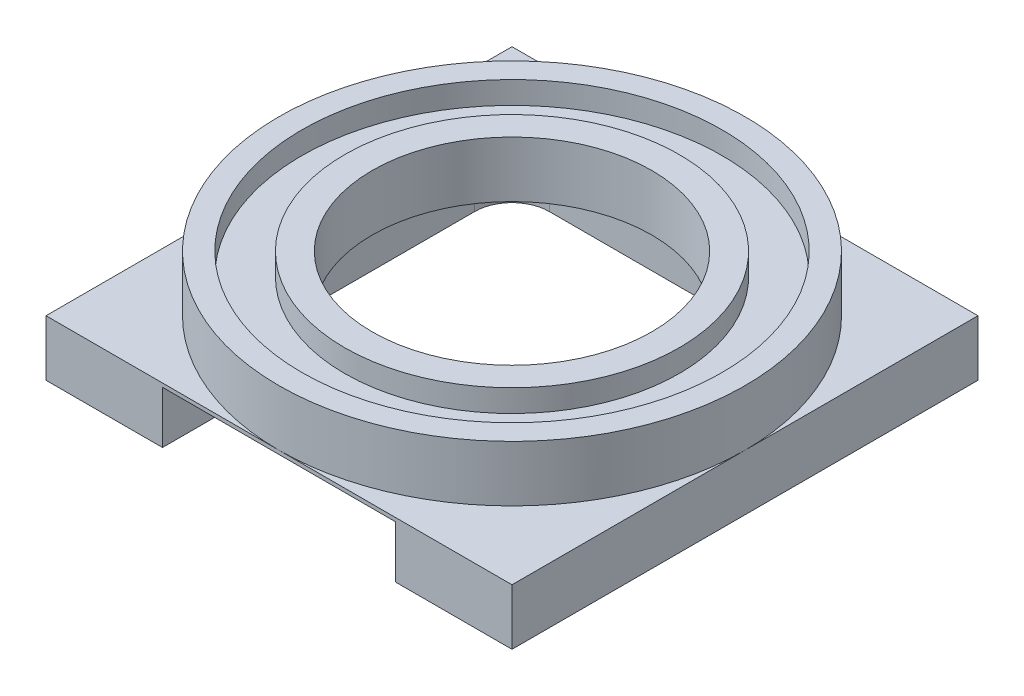
ISO-10303-21;
HEADER;
FILE_DESCRIPTION(('STEP AP214'),'2;1');
FILE_NAME('part.step','',(''),(''),'','','');
FILE_SCHEMA(('AUTOMOTIVE_DESIGN { 1 0 10303 214 1 1 1 1 }'));
ENDSEC;
DATA;
#1=APPLICATION_CONTEXT('core data for automotive mechanical design processes');
#2=APPLICATION_PROTOCOL_DEFINITION('international standard','automotive_design',2000,#1);
#3=PRODUCT_CONTEXT('',#1,'mechanical');
#4=PRODUCT('Part','Part','',(#3));
#5=PRODUCT_RELATED_PRODUCT_CATEGORY('part','',(#4));
#6=PRODUCT_DEFINITION_FORMATION('','',#4);
#7=PRODUCT_DEFINITION_CONTEXT('part definition',#1,'design');
#8=PRODUCT_DEFINITION('design','',#6,#7);
#9=PRODUCT_DEFINITION_SHAPE('','',#8);
#10=(LENGTH_UNIT() NAMED_UNIT(*) SI_UNIT(.MILLI.,.METRE.));
#11=(NAMED_UNIT(*) PLANE_ANGLE_UNIT() SI_UNIT($,.RADIAN.));
#12=(NAMED_UNIT(*) SI_UNIT($,.STERADIAN.) SOLID_ANGLE_UNIT());
#13=UNCERTAINTY_MEASURE_WITH_UNIT(LENGTH_MEASURE(1.E-05),#10,'distance_accuracy_value','');
#14=(GEOMETRIC_REPRESENTATION_CONTEXT(3) GLOBAL_UNCERTAINTY_ASSIGNED_CONTEXT((#13)) GLOBAL_UNIT_ASSIGNED_CONTEXT((#10,
#11,#12)) REPRESENTATION_CONTEXT('',''));
#15=CARTESIAN_POINT('',(0.,0.,0.));
#16=DIRECTION('',(0.,0.,1.));
#17=DIRECTION('',(1.,0.,0.));
#18=AXIS2_PLACEMENT_3D('',#15,#16,#17);
#19=CARTESIAN_POINT('',(0.,0.,0.));
#20=DIRECTION('',(0.,1.,0.));
#21=DIRECTION('',(0.,0.,1.));
#22=AXIS2_PLACEMENT_3D('',#19,#20,#21);
#23=PLANE('',#22);
#24=CARTESIAN_POINT('',(0.,0.,0.));
#25=DIRECTION('',(0.,1.,0.));
#26=DIRECTION('',(0.,0.,1.));
#27=AXIS2_PLACEMENT_3D('',#24,#25,#26);
#28=CIRCLE('',#27,75.);
#29=CARTESIAN_POINT('',(0.,0.,75.));
#30=VERTEX_POINT('',#29);
#31=EDGE_CURVE('E295',#30,#30,#28,.T.);
#32=ORIENTED_EDGE('',*,*,#31,.T.);
#33=EDGE_LOOP('',(#32));
#34=FACE_BOUND('',#33,.T.);
#35=DIRECTION('',(0.,0.,1.));
#36=VECTOR('',#35,1.);
#37=CARTESIAN_POINT('',(-88.3883476483184,0.,0.));
#38=LINE('',#37,#36);
#39=CARTESIAN_POINT('',(-88.3883476483184,0.,-68.3883476483183));
#40=VERTEX_POINT('',#39);
#41=CARTESIAN_POINT('',(-88.3883476483184,0.,68.3883476483183));
#42=VERTEX_POINT('',#41);
#43=EDGE_CURVE('E66',#40,#42,#38,.T.);
#44=ORIENTED_EDGE('',*,*,#43,.F.);
#45=CARTESIAN_POINT('',(-68.3883476483184,0.,-68.3883476483184));
#46=DIRECTION('',(0.,-1.,0.));
#47=DIRECTION('',(0.,0.,-1.));
#48=AXIS2_PLACEMENT_3D('',#45,#46,#47);
#49=CIRCLE('',#48,20.);
#50=CARTESIAN_POINT('',(-68.3883476483183,0.,-88.3883476483184));
#51=VERTEX_POINT('',#50);
#52=EDGE_CURVE('E249',#51,#40,#49,.F.);
#53=ORIENTED_EDGE('',*,*,#52,.F.);
#54=DIRECTION('',(1.,0.,0.));
#55=VECTOR('',#54,1.);
#56=CARTESIAN_POINT('',(0.,0.,-88.3883476483184));
#57=LINE('',#56,#55);
#58=CARTESIAN_POINT('',(68.3883476483183,0.,-88.3883476483184));
#59=VERTEX_POINT('',#58);
#60=EDGE_CURVE('E247',#51,#59,#57,.T.);
#61=ORIENTED_EDGE('',*,*,#60,.T.);
#62=CARTESIAN_POINT('',(68.3883476483184,0.,-68.3883476483184));
#63=DIRECTION('',(0.,-1.,0.));
#64=DIRECTION('',(0.,0.,-1.));
#65=AXIS2_PLACEMENT_3D('',#62,#63,#64);
#66=CIRCLE('',#65,20.);
#67=CARTESIAN_POINT('',(88.3883476483184,0.,-68.3883476483183));
#68=VERTEX_POINT('',#67);
#69=EDGE_CURVE('E245',#59,#68,#66,.T.);
#70=ORIENTED_EDGE('',*,*,#69,.T.);
#71=DIRECTION('',(0.,0.,1.));
#72=VECTOR('',#71,1.);
#73=CARTESIAN_POINT('',(88.3883476483184,0.,0.));
#74=LINE('',#73,#72);
#75=CARTESIAN_POINT('',(88.3883476483184,0.,68.3883476483183));
#76=VERTEX_POINT('',#75);
#77=EDGE_CURVE('E243',#68,#76,#74,.T.);
#78=ORIENTED_EDGE('',*,*,#77,.T.);
#79=CARTESIAN_POINT('',(68.3883476483184,0.,68.3883476483184));
#80=DIRECTION('',(0.,-1.,0.));
#81=DIRECTION('',(0.,0.,-1.));
#82=AXIS2_PLACEMENT_3D('',#79,#80,#81);
#83=CIRCLE('',#82,20.);
#84=CARTESIAN_POINT('',(68.3883476483183,0.,88.3883476483184));
#85=VERTEX_POINT('',#84);
#86=EDGE_CURVE('E240',#85,#76,#83,.F.);
#87=ORIENTED_EDGE('',*,*,#86,.F.);
#88=DIRECTION('',(1.,0.,0.));
#89=VECTOR('',#88,1.);
#90=CARTESIAN_POINT('',(0.,0.,88.3883476483184));
#91=LINE('',#90,#89);
#92=CARTESIAN_POINT('',(-68.3883476483183,0.,88.3883476483184));
#93=VERTEX_POINT('',#92);
#94=EDGE_CURVE('E237',#93,#85,#91,.T.);
#95=ORIENTED_EDGE('',*,*,#94,.F.);
#96=CARTESIAN_POINT('',(-68.3883476483184,0.,68.3883476483184));
#97=DIRECTION('',(0.,-1.,0.));
#98=DIRECTION('',(0.,0.,-1.));
#99=AXIS2_PLACEMENT_3D('',#96,#97,#98);
#100=CIRCLE('',#99,20.);
#101=EDGE_CURVE('E234',#42,#93,#100,.F.);
#102=ORIENTED_EDGE('',*,*,#101,.F.);
#103=EDGE_LOOP('',(#44,#53,#61,#70,#78,#87,#95,#102));
#104=FACE_BOUND('',#103,.T.);
#105=ADVANCED_FACE('F43',(#34,#104),#23,.F.);
#106=CARTESIAN_POINT('',(0.,30.,0.));
#107=DIRECTION('',(0.,1.,0.));
#108=DIRECTION('',(0.,0.,1.));
#109=AXIS2_PLACEMENT_3D('',#106,#107,#108);
#110=PLANE('',#109);
#111=CARTESIAN_POINT('',(0.,30.,0.));
#112=DIRECTION('',(0.,1.,0.));
#113=DIRECTION('',(0.,0.,1.));
#114=AXIS2_PLACEMENT_3D('',#111,#112,#113);
#115=CIRCLE('',#114,75.);
#116=CARTESIAN_POINT('',(0.,30.,75.));
#117=VERTEX_POINT('',#116);
#118=EDGE_CURVE('E298',#117,#117,#115,.T.);
#119=ORIENTED_EDGE('',*,*,#118,.F.);
#120=EDGE_LOOP('',(#119));
#121=FACE_BOUND('',#120,.T.);
#122=CARTESIAN_POINT('',(0.,30.,0.));
#123=DIRECTION('',(0.,1.,0.));
#124=DIRECTION('',(0.,0.,1.));
#125=AXIS2_PLACEMENT_3D('',#122,#123,#124);
#126=CIRCLE('',#125,89.75);
#127=CARTESIAN_POINT('',(0.,30.,89.75));
#128=VERTEX_POINT('',#127);
#129=EDGE_CURVE('E277',#128,#128,#126,.T.);
#130=ORIENTED_EDGE('',*,*,#129,.T.);
#131=EDGE_LOOP('',(#130));
#132=FACE_BOUND('',#131,.T.);
#133=ADVANCED_FACE('F395',(#121,#132),#110,.T.);
#134=CARTESIAN_POINT('',(0.,30.,0.));
#135=DIRECTION('',(0.,-1.,0.));
#136=DIRECTION('',(0.,0.,-1.));
#137=AXIS2_PLACEMENT_3D('',#134,#135,#136);
#138=CYLINDRICAL_SURFACE('',#137,75.);
#139=ORIENTED_EDGE('',*,*,#118,.T.);
#140=EDGE_LOOP('',(#139));
#141=FACE_BOUND('',#140,.T.);
#142=ORIENTED_EDGE('',*,*,#31,.F.);
#143=EDGE_LOOP('',(#142));
#144=FACE_BOUND('',#143,.T.);
#145=ADVANCED_FACE('F45',(#141,#144),#138,.F.);
#146=CARTESIAN_POINT('',(0.,30.,0.));
#147=DIRECTION('',(0.,-1.,0.));
#148=DIRECTION('',(0.,0.,-1.));
#149=AXIS2_PLACEMENT_3D('',#146,#147,#148);
#150=CYLINDRICAL_SURFACE('',#149,125.);
#151=CARTESIAN_POINT('',(0.,30.,0.));
#152=DIRECTION('',(0.,1.,0.));
#153=DIRECTION('',(0.,0.,1.));
#154=AXIS2_PLACEMENT_3D('',#151,#152,#153);
#155=CIRCLE('',#154,125.);
#156=CARTESIAN_POINT('',(0.,30.,125.));
#157=VERTEX_POINT('',#156);
#158=EDGE_CURVE('E301',#157,#157,#155,.T.);
#159=ORIENTED_EDGE('',*,*,#158,.F.);
#160=EDGE_LOOP('',(#159));
#161=FACE_BOUND('',#160,.T.);
#162=CARTESIAN_POINT('',(0.,0.,0.));
#163=DIRECTION('',(0.,1.,0.));
#164=DIRECTION('',(0.,0.,1.));
#165=AXIS2_PLACEMENT_3D('',#162,#163,#164);
#166=CIRCLE('',#165,125.);
#167=CARTESIAN_POINT('',(0.,0.,125.));
#168=VERTEX_POINT('',#167);
#169=CARTESIAN_POINT('',(125.,0.,0.));
#170=VERTEX_POINT('',#169);
#171=EDGE_CURVE('E302',#168,#170,#166,.T.);
#172=ORIENTED_EDGE('',*,*,#171,.T.);
#173=CARTESIAN_POINT('',(0.,0.,-125.));
#174=VERTEX_POINT('',#173);
#175=EDGE_CURVE('E309',#170,#174,#166,.T.);
#176=ORIENTED_EDGE('',*,*,#175,.T.);
#177=CARTESIAN_POINT('',(-125.,0.,0.));
#178=VERTEX_POINT('',#177);
#179=EDGE_CURVE('E336',#174,#178,#166,.T.);
#180=ORIENTED_EDGE('',*,*,#179,.T.);
#181=EDGE_CURVE('E307',#178,#168,#166,.T.);
#182=ORIENTED_EDGE('',*,*,#181,.T.);
#183=EDGE_LOOP('',(#172,#176,#180,#182));
#184=FACE_BOUND('',#183,.T.);
#185=ADVANCED_FACE('F335',(#161,#184),#150,.T.);
#186=CARTESIAN_POINT('',(0.,30.,0.));
#187=DIRECTION('',(0.,1.,0.));
#188=DIRECTION('',(0.,0.,1.));
#189=AXIS2_PLACEMENT_3D('',#186,#187,#188);
#190=CIRCLE('',#189,112.75);
#191=CARTESIAN_POINT('',(0.,30.,112.75));
#192=VERTEX_POINT('',#191);
#193=EDGE_CURVE('E289',#192,#192,#190,.T.);
#194=ORIENTED_EDGE('',*,*,#193,.F.);
#195=EDGE_LOOP('',(#194));
#196=FACE_BOUND('',#195,.T.);
#197=ORIENTED_EDGE('',*,*,#158,.T.);
#198=EDGE_LOOP('',(#197));
#199=FACE_BOUND('',#198,.T.);
#200=ADVANCED_FACE('F405',(#196,#199),#110,.T.);
#201=CARTESIAN_POINT('',(0.,18.,0.));
#202=DIRECTION('',(0.,1.,0.));
#203=DIRECTION('',(0.,0.,1.));
#204=AXIS2_PLACEMENT_3D('',#201,#202,#203);
#205=CYLINDRICAL_SURFACE('',#204,112.75);
#206=CARTESIAN_POINT('',(0.,18.,0.));
#207=DIRECTION('',(0.,1.,0.));
#208=DIRECTION('',(0.,0.,1.));
#209=AXIS2_PLACEMENT_3D('',#206,#207,#208);
#210=CIRCLE('',#209,112.75);
#211=CARTESIAN_POINT('',(0.,18.,112.75));
#212=VERTEX_POINT('',#211);
#213=EDGE_CURVE('E292',#212,#212,#210,.T.);
#214=ORIENTED_EDGE('',*,*,#213,.F.);
#215=EDGE_LOOP('',(#214));
#216=FACE_BOUND('',#215,.T.);
#217=ORIENTED_EDGE('',*,*,#193,.T.);
#218=EDGE_LOOP('',(#217));
#219=FACE_BOUND('',#218,.T.);
#220=ADVANCED_FACE('F412',(#216,#219),#205,.F.);
#221=CARTESIAN_POINT('',(0.,18.,0.));
#222=DIRECTION('',(0.,1.,0.));
#223=DIRECTION('',(0.,0.,1.));
#224=AXIS2_PLACEMENT_3D('',#221,#222,#223);
#225=PLANE('',#224);
#226=CARTESIAN_POINT('',(0.,18.,0.));
#227=DIRECTION('',(0.,1.,0.));
#228=DIRECTION('',(0.,0.,1.));
#229=AXIS2_PLACEMENT_3D('',#226,#227,#228);
#230=CIRCLE('',#229,89.75);
#231=CARTESIAN_POINT('',(0.,18.,89.75));
#232=VERTEX_POINT('',#231);
#233=EDGE_CURVE('E286',#232,#232,#230,.T.);
#234=ORIENTED_EDGE('',*,*,#233,.F.);
#235=EDGE_LOOP('',(#234));
#236=FACE_BOUND('',#235,.T.);
#237=ORIENTED_EDGE('',*,*,#213,.T.);
#238=EDGE_LOOP('',(#237));
#239=FACE_BOUND('',#238,.T.);
#240=ADVANCED_FACE('F427',(#236,#239),#225,.T.);
#241=CARTESIAN_POINT('',(0.,18.,0.));
#242=DIRECTION('',(0.,1.,0.));
#243=DIRECTION('',(0.,0.,1.));
#244=AXIS2_PLACEMENT_3D('',#241,#242,#243);
#245=CYLINDRICAL_SURFACE('',#244,89.75);
#246=ORIENTED_EDGE('',*,*,#233,.T.);
#247=EDGE_LOOP('',(#246));
#248=FACE_BOUND('',#247,.T.);
#249=ORIENTED_EDGE('',*,*,#129,.F.);
#250=EDGE_LOOP('',(#249));
#251=FACE_BOUND('',#250,.T.);
#252=ADVANCED_FACE('F426',(#248,#251),#245,.T.);
#253=CARTESIAN_POINT('',(0.,0.,0.));
#254=DIRECTION('',(0.,-1.,0.));
#255=DIRECTION('',(0.,0.,-1.));
#256=AXIS2_PLACEMENT_3D('',#253,#254,#255);
#257=PLANE('',#256);
#258=ORIENTED_EDGE('',*,*,#171,.F.);
#259=DIRECTION('',(1.,0.,0.));
#260=VECTOR('',#259,1.);
#261=CARTESIAN_POINT('',(0.,0.,125.));
#262=LINE('',#261,#260);
#263=CARTESIAN_POINT('',(125.,0.,125.));
#264=VERTEX_POINT('',#263);
#265=EDGE_CURVE('E230',#168,#264,#262,.T.);
#266=ORIENTED_EDGE('',*,*,#265,.T.);
#267=DIRECTION('',(0.,0.,1.));
#268=VECTOR('',#267,1.);
#269=CARTESIAN_POINT('',(125.,0.,0.));
#270=LINE('',#269,#268);
#271=EDGE_CURVE('E226',#170,#264,#270,.T.);
#272=ORIENTED_EDGE('',*,*,#271,.F.);
#273=EDGE_LOOP('',(#258,#266,#272));
#274=FACE_BOUND('',#273,.T.);
#275=ADVANCED_FACE('F331',(#274),#257,.F.);
#276=ORIENTED_EDGE('',*,*,#175,.F.);
#277=CARTESIAN_POINT('',(125.,0.,-125.));
#278=VERTEX_POINT('',#277);
#279=EDGE_CURVE('E227',#278,#170,#270,.T.);
#280=ORIENTED_EDGE('',*,*,#279,.F.);
#281=DIRECTION('',(1.,0.,0.));
#282=VECTOR('',#281,1.);
#283=CARTESIAN_POINT('',(0.,0.,-125.));
#284=LINE('',#283,#282);
#285=EDGE_CURVE('E221',#174,#278,#284,.T.);
#286=ORIENTED_EDGE('',*,*,#285,.F.);
#287=EDGE_LOOP('',(#276,#280,#286));
#288=FACE_BOUND('',#287,.T.);
#289=ADVANCED_FACE('F342',(#288),#257,.F.);
#290=ORIENTED_EDGE('',*,*,#179,.F.);
#291=CARTESIAN_POINT('',(-125.,0.,-125.));
#292=VERTEX_POINT('',#291);
#293=EDGE_CURVE('E223',#292,#174,#284,.T.);
#294=ORIENTED_EDGE('',*,*,#293,.F.);
#295=DIRECTION('',(0.,0.,1.));
#296=VECTOR('',#295,1.);
#297=CARTESIAN_POINT('',(-125.,0.,0.));
#298=LINE('',#297,#296);
#299=EDGE_CURVE('E218',#292,#178,#298,.T.);
#300=ORIENTED_EDGE('',*,*,#299,.T.);
#301=EDGE_LOOP('',(#290,#294,#300));
#302=FACE_BOUND('',#301,.T.);
#303=ADVANCED_FACE('F348',(#302),#257,.F.);
#304=CARTESIAN_POINT('',(-88.3883476483184,-30.,0.));
#305=DIRECTION('',(-1.,0.,0.));
#306=DIRECTION('',(0.,0.,1.));
#307=AXIS2_PLACEMENT_3D('',#304,#305,#306);
#308=PLANE('',#307);
#309=ORIENTED_EDGE('',*,*,#43,.T.);
#310=DIRECTION('',(0.,1.,0.));
#311=VECTOR('',#310,1.);
#312=CARTESIAN_POINT('',(-88.3883476483184,-30.,68.3883476483183));
#313=LINE('',#312,#311);
#314=CARTESIAN_POINT('',(-88.3883476483184,-30.,68.3883476483183));
#315=VERTEX_POINT('',#314);
#316=EDGE_CURVE('E274',#315,#42,#313,.T.);
#317=ORIENTED_EDGE('',*,*,#316,.F.);
#318=DIRECTION('',(0.,0.,1.));
#319=VECTOR('',#318,1.);
#320=CARTESIAN_POINT('',(-88.3883476483184,-30.,0.));
#321=LINE('',#320,#319);
#322=CARTESIAN_POINT('',(-88.3883476483184,-30.,-68.3883476483183));
#323=VERTEX_POINT('',#322);
#324=EDGE_CURVE('E192',#323,#315,#321,.T.);
#325=ORIENTED_EDGE('',*,*,#324,.F.);
#326=DIRECTION('',(0.,1.,0.));
#327=VECTOR('',#326,1.);
#328=CARTESIAN_POINT('',(-88.3883476483184,-30.,-68.3883476483183));
#329=LINE('',#328,#327);
#330=EDGE_CURVE('E252',#323,#40,#329,.T.);
#331=ORIENTED_EDGE('',*,*,#330,.T.);
#332=EDGE_LOOP('',(#309,#317,#325,#331));
#333=FACE_BOUND('',#332,.T.);
#334=ADVANCED_FACE('F391',(#333),#308,.F.);
#335=CARTESIAN_POINT('',(-68.3883476483184,-30.,68.3883476483184));
#336=DIRECTION('',(0.,1.,0.));
#337=DIRECTION('',(0.,0.,1.));
#338=AXIS2_PLACEMENT_3D('',#335,#336,#337);
#339=CYLINDRICAL_SURFACE('',#338,20.);
#340=ORIENTED_EDGE('',*,*,#101,.T.);
#341=DIRECTION('',(0.,1.,0.));
#342=VECTOR('',#341,1.);
#343=CARTESIAN_POINT('',(-68.3883476483183,-30.,88.3883476483184));
#344=LINE('',#343,#342);
#345=CARTESIAN_POINT('',(-68.3883476483183,-30.,88.3883476483184));
#346=VERTEX_POINT('',#345);
#347=EDGE_CURVE('E271',#346,#93,#344,.T.);
#348=ORIENTED_EDGE('',*,*,#347,.F.);
#349=CARTESIAN_POINT('',(-68.3883476483184,-30.,68.3883476483184));
#350=DIRECTION('',(0.,-1.,0.));
#351=DIRECTION('',(0.,0.,-1.));
#352=AXIS2_PLACEMENT_3D('',#349,#350,#351);
#353=CIRCLE('',#352,20.);
#354=EDGE_CURVE('E196',#315,#346,#353,.F.);
#355=ORIENTED_EDGE('',*,*,#354,.F.);
#356=ORIENTED_EDGE('',*,*,#316,.T.);
#357=EDGE_LOOP('',(#340,#348,#355,#356));
#358=FACE_BOUND('',#357,.T.);
#359=ADVANCED_FACE('F393',(#358),#339,.F.);
#360=CARTESIAN_POINT('',(0.,-30.,88.3883476483184));
#361=DIRECTION('',(0.,0.,1.));
#362=DIRECTION('',(1.,0.,0.));
#363=AXIS2_PLACEMENT_3D('',#360,#361,#362);
#364=PLANE('',#363);
#365=DIRECTION('',(-1.,0.,0.));
#366=VECTOR('',#365,1.);
#367=CARTESIAN_POINT('',(0.,-2.00000000000001,88.3883476483184));
#368=LINE('',#367,#366);
#369=CARTESIAN_POINT('',(62.5,-2.,88.3883476483184));
#370=VERTEX_POINT('',#369);
#371=CARTESIAN_POINT('',(-62.5,-2.00000000000002,88.3883476483184));
#372=VERTEX_POINT('',#371);
#373=EDGE_CURVE('E351',#370,#372,#368,.T.);
#374=ORIENTED_EDGE('',*,*,#373,.T.);
#375=DIRECTION('',(0.,-1.,0.));
#376=VECTOR('',#375,1.);
#377=CARTESIAN_POINT('',(-62.5,-30.,88.3883476483184));
#378=LINE('',#377,#376);
#379=CARTESIAN_POINT('',(-62.5,-30.,88.3883476483184));
#380=VERTEX_POINT('',#379);
#381=EDGE_CURVE('E353',#372,#380,#378,.T.);
#382=ORIENTED_EDGE('',*,*,#381,.T.);
#383=DIRECTION('',(1.,0.,0.));
#384=VECTOR('',#383,1.);
#385=CARTESIAN_POINT('',(0.,-30.,88.3883476483184));
#386=LINE('',#385,#384);
#387=EDGE_CURVE('E186',#346,#380,#386,.T.);
#388=ORIENTED_EDGE('',*,*,#387,.F.);
#389=ORIENTED_EDGE('',*,*,#347,.T.);
#390=ORIENTED_EDGE('',*,*,#94,.T.);
#391=DIRECTION('',(0.,1.,0.));
#392=VECTOR('',#391,1.);
#393=CARTESIAN_POINT('',(68.3883476483183,-30.,88.3883476483184));
#394=LINE('',#393,#392);
#395=CARTESIAN_POINT('',(68.3883476483183,-30.,88.3883476483184));
#396=VERTEX_POINT('',#395);
#397=EDGE_CURVE('E268',#396,#85,#394,.T.);
#398=ORIENTED_EDGE('',*,*,#397,.F.);
#399=CARTESIAN_POINT('',(62.5,-30.,88.3883476483184));
#400=VERTEX_POINT('',#399);
#401=EDGE_CURVE('E203',#400,#396,#386,.T.);
#402=ORIENTED_EDGE('',*,*,#401,.F.);
#403=DIRECTION('',(0.,1.,0.));
#404=VECTOR('',#403,1.);
#405=CARTESIAN_POINT('',(62.5,-30.,88.3883476483184));
#406=LINE('',#405,#404);
#407=EDGE_CURVE('E58',#400,#370,#406,.T.);
#408=ORIENTED_EDGE('',*,*,#407,.T.);
#409=EDGE_LOOP('',(#374,#382,#388,#389,#390,#398,#402,#408));
#410=FACE_BOUND('',#409,.T.);
#411=ADVANCED_FACE('F365',(#410),#364,.F.);
#412=CARTESIAN_POINT('',(68.3883476483184,-30.,68.3883476483184));
#413=DIRECTION('',(0.,1.,0.));
#414=DIRECTION('',(0.,0.,1.));
#415=AXIS2_PLACEMENT_3D('',#412,#413,#414);
#416=CYLINDRICAL_SURFACE('',#415,20.);
#417=ORIENTED_EDGE('',*,*,#86,.T.);
#418=DIRECTION('',(0.,1.,0.));
#419=VECTOR('',#418,1.);
#420=CARTESIAN_POINT('',(88.3883476483184,-30.,68.3883476483183));
#421=LINE('',#420,#419);
#422=CARTESIAN_POINT('',(88.3883476483184,-30.,68.3883476483183));
#423=VERTEX_POINT('',#422);
#424=EDGE_CURVE('E265',#423,#76,#421,.T.);
#425=ORIENTED_EDGE('',*,*,#424,.F.);
#426=CARTESIAN_POINT('',(68.3883476483184,-30.,68.3883476483184));
#427=DIRECTION('',(0.,-1.,0.));
#428=DIRECTION('',(0.,0.,-1.));
#429=AXIS2_PLACEMENT_3D('',#426,#427,#428);
#430=CIRCLE('',#429,20.);
#431=EDGE_CURVE('E205',#396,#423,#430,.F.);
#432=ORIENTED_EDGE('',*,*,#431,.F.);
#433=ORIENTED_EDGE('',*,*,#397,.T.);
#434=EDGE_LOOP('',(#417,#425,#432,#433));
#435=FACE_BOUND('',#434,.T.);
#436=ADVANCED_FACE('F372',(#435),#416,.F.);
#437=CARTESIAN_POINT('',(88.3883476483184,-30.,0.));
#438=DIRECTION('',(-1.,0.,0.));
#439=DIRECTION('',(0.,0.,1.));
#440=AXIS2_PLACEMENT_3D('',#437,#438,#439);
#441=PLANE('',#440);
#442=ORIENTED_EDGE('',*,*,#77,.F.);
#443=DIRECTION('',(0.,1.,0.));
#444=VECTOR('',#443,1.);
#445=CARTESIAN_POINT('',(88.3883476483184,-30.,-68.3883476483183));
#446=LINE('',#445,#444);
#447=CARTESIAN_POINT('',(88.3883476483184,-30.,-68.3883476483183));
#448=VERTEX_POINT('',#447);
#449=EDGE_CURVE('E262',#448,#68,#446,.T.);
#450=ORIENTED_EDGE('',*,*,#449,.F.);
#451=DIRECTION('',(0.,0.,1.));
#452=VECTOR('',#451,1.);
#453=CARTESIAN_POINT('',(88.3883476483184,-30.,0.));
#454=LINE('',#453,#452);
#455=EDGE_CURVE('E207',#448,#423,#454,.T.);
#456=ORIENTED_EDGE('',*,*,#455,.T.);
#457=ORIENTED_EDGE('',*,*,#424,.T.);
#458=EDGE_LOOP('',(#442,#450,#456,#457));
#459=FACE_BOUND('',#458,.T.);
#460=ADVANCED_FACE('F375',(#459),#441,.T.);
#461=CARTESIAN_POINT('',(68.3883476483184,-30.,-68.3883476483184));
#462=DIRECTION('',(0.,1.,0.));
#463=DIRECTION('',(0.,0.,1.));
#464=AXIS2_PLACEMENT_3D('',#461,#462,#463);
#465=CYLINDRICAL_SURFACE('',#464,20.);
#466=ORIENTED_EDGE('',*,*,#69,.F.);
#467=DIRECTION('',(0.,1.,0.));
#468=VECTOR('',#467,1.);
#469=CARTESIAN_POINT('',(68.3883476483183,-30.,-88.3883476483184));
#470=LINE('',#469,#468);
#471=CARTESIAN_POINT('',(68.3883476483183,-30.,-88.3883476483184));
#472=VERTEX_POINT('',#471);
#473=EDGE_CURVE('E259',#472,#59,#470,.T.);
#474=ORIENTED_EDGE('',*,*,#473,.F.);
#475=CARTESIAN_POINT('',(68.3883476483184,-30.,-68.3883476483184));
#476=DIRECTION('',(0.,-1.,0.));
#477=DIRECTION('',(0.,0.,-1.));
#478=AXIS2_PLACEMENT_3D('',#475,#476,#477);
#479=CIRCLE('',#478,20.);
#480=EDGE_CURVE('E210',#472,#448,#479,.T.);
#481=ORIENTED_EDGE('',*,*,#480,.T.);
#482=ORIENTED_EDGE('',*,*,#449,.T.);
#483=EDGE_LOOP('',(#466,#474,#481,#482));
#484=FACE_BOUND('',#483,.T.);
#485=ADVANCED_FACE('F378',(#484),#465,.F.);
#486=CARTESIAN_POINT('',(0.,-30.,-88.3883476483184));
#487=DIRECTION('',(0.,0.,1.));
#488=DIRECTION('',(1.,0.,0.));
#489=AXIS2_PLACEMENT_3D('',#486,#487,#488);
#490=PLANE('',#489);
#491=ORIENTED_EDGE('',*,*,#60,.F.);
#492=DIRECTION('',(0.,1.,0.));
#493=VECTOR('',#492,1.);
#494=CARTESIAN_POINT('',(-68.3883476483183,-30.,-88.3883476483184));
#495=LINE('',#494,#493);
#496=CARTESIAN_POINT('',(-68.3883476483183,-30.,-88.3883476483184));
#497=VERTEX_POINT('',#496);
#498=EDGE_CURVE('E255',#497,#51,#495,.T.);
#499=ORIENTED_EDGE('',*,*,#498,.F.);
#500=DIRECTION('',(1.,0.,0.));
#501=VECTOR('',#500,1.);
#502=CARTESIAN_POINT('',(0.,-30.,-88.3883476483184));
#503=LINE('',#502,#501);
#504=EDGE_CURVE('E213',#497,#472,#503,.T.);
#505=ORIENTED_EDGE('',*,*,#504,.T.);
#506=ORIENTED_EDGE('',*,*,#473,.T.);
#507=EDGE_LOOP('',(#491,#499,#505,#506));
#508=FACE_BOUND('',#507,.T.);
#509=ADVANCED_FACE('F382',(#508),#490,.T.);
#510=CARTESIAN_POINT('',(-125.,-30.,0.));
#511=DIRECTION('',(-1.,0.,0.));
#512=DIRECTION('',(0.,0.,1.));
#513=AXIS2_PLACEMENT_3D('',#510,#511,#512);
#514=PLANE('',#513);
#515=ORIENTED_EDGE('',*,*,#299,.F.);
#516=DIRECTION('',(0.,1.,0.));
#517=VECTOR('',#516,1.);
#518=CARTESIAN_POINT('',(-125.,-30.,-125.));
#519=LINE('',#518,#517);
#520=CARTESIAN_POINT('',(-125.,-30.,-125.));
#521=VERTEX_POINT('',#520);
#522=EDGE_CURVE('E256',#521,#292,#519,.T.);
#523=ORIENTED_EDGE('',*,*,#522,.F.);
#524=DIRECTION('',(0.,0.,1.));
#525=VECTOR('',#524,1.);
#526=CARTESIAN_POINT('',(-125.,-30.,0.));
#527=LINE('',#526,#525);
#528=CARTESIAN_POINT('',(-125.,-30.,125.));
#529=VERTEX_POINT('',#528);
#530=EDGE_CURVE('E251',#521,#529,#527,.T.);
#531=ORIENTED_EDGE('',*,*,#530,.T.);
#532=DIRECTION('',(0.,1.,0.));
#533=VECTOR('',#532,1.);
#534=CARTESIAN_POINT('',(-125.,-30.,125.));
#535=LINE('',#534,#533);
#536=CARTESIAN_POINT('',(-125.,0.,125.));
#537=VERTEX_POINT('',#536);
#538=EDGE_CURVE('E190',#529,#537,#535,.T.);
#539=ORIENTED_EDGE('',*,*,#538,.T.);
#540=EDGE_CURVE('E222',#178,#537,#298,.T.);
#541=ORIENTED_EDGE('',*,*,#540,.F.);
#542=EDGE_LOOP('',(#515,#523,#531,#539,#541));
#543=FACE_BOUND('',#542,.T.);
#544=ADVANCED_FACE('F350',(#543),#514,.T.);
#545=CARTESIAN_POINT('',(0.,-30.,-125.));
#546=DIRECTION('',(0.,0.,1.));
#547=DIRECTION('',(1.,0.,0.));
#548=AXIS2_PLACEMENT_3D('',#545,#546,#547);
#549=PLANE('',#548);
#550=ORIENTED_EDGE('',*,*,#293,.T.);
#551=ORIENTED_EDGE('',*,*,#285,.T.);
#552=DIRECTION('',(0.,1.,0.));
#553=VECTOR('',#552,1.);
#554=CARTESIAN_POINT('',(125.,-30.,-125.));
#555=LINE('',#554,#553);
#556=CARTESIAN_POINT('',(125.,-30.,-125.));
#557=VERTEX_POINT('',#556);
#558=EDGE_CURVE('E282',#557,#278,#555,.T.);
#559=ORIENTED_EDGE('',*,*,#558,.F.);
#560=DIRECTION('',(1.,0.,0.));
#561=VECTOR('',#560,1.);
#562=CARTESIAN_POINT('',(0.,-30.,-125.));
#563=LINE('',#562,#561);
#564=EDGE_CURVE('E321',#521,#557,#563,.T.);
#565=ORIENTED_EDGE('',*,*,#564,.F.);
#566=ORIENTED_EDGE('',*,*,#522,.T.);
#567=EDGE_LOOP('',(#550,#551,#559,#565,#566));
#568=FACE_BOUND('',#567,.T.);
#569=ADVANCED_FACE('F345',(#568),#549,.F.);
#570=CARTESIAN_POINT('',(125.,-30.,0.));
#571=DIRECTION('',(-1.,0.,0.));
#572=DIRECTION('',(0.,0.,1.));
#573=AXIS2_PLACEMENT_3D('',#570,#571,#572);
#574=PLANE('',#573);
#575=ORIENTED_EDGE('',*,*,#279,.T.);
#576=ORIENTED_EDGE('',*,*,#271,.T.);
#577=DIRECTION('',(0.,1.,0.));
#578=VECTOR('',#577,1.);
#579=CARTESIAN_POINT('',(125.,-30.,125.));
#580=LINE('',#579,#578);
#581=CARTESIAN_POINT('',(125.,-30.,125.));
#582=VERTEX_POINT('',#581);
#583=EDGE_CURVE('E279',#582,#264,#580,.T.);
#584=ORIENTED_EDGE('',*,*,#583,.F.);
#585=DIRECTION('',(0.,0.,1.));
#586=VECTOR('',#585,1.);
#587=CARTESIAN_POINT('',(125.,-30.,0.));
#588=LINE('',#587,#586);
#589=EDGE_CURVE('E198',#557,#582,#588,.T.);
#590=ORIENTED_EDGE('',*,*,#589,.F.);
#591=ORIENTED_EDGE('',*,*,#558,.T.);
#592=EDGE_LOOP('',(#575,#576,#584,#590,#591));
#593=FACE_BOUND('',#592,.T.);
#594=ADVANCED_FACE('F324',(#593),#574,.F.);
#595=CARTESIAN_POINT('',(0.,-30.,125.));
#596=DIRECTION('',(0.,0.,1.));
#597=DIRECTION('',(1.,0.,0.));
#598=AXIS2_PLACEMENT_3D('',#595,#596,#597);
#599=PLANE('',#598);
#600=DIRECTION('',(0.,-1.,0.));
#601=VECTOR('',#600,1.);
#602=CARTESIAN_POINT('',(-62.5,-2.00000000000002,125.));
#603=LINE('',#602,#601);
#604=CARTESIAN_POINT('',(-62.5,-2.00000000000002,125.));
#605=VERTEX_POINT('',#604);
#606=CARTESIAN_POINT('',(-62.5,-30.,125.));
#607=VERTEX_POINT('',#606);
#608=EDGE_CURVE('E167',#605,#607,#603,.T.);
#609=ORIENTED_EDGE('',*,*,#608,.F.);
#610=DIRECTION('',(-1.,0.,0.));
#611=VECTOR('',#610,1.);
#612=CARTESIAN_POINT('',(62.5,-2.,125.));
#613=LINE('',#612,#611);
#614=CARTESIAN_POINT('',(62.5,-2.,125.));
#615=VERTEX_POINT('',#614);
#616=EDGE_CURVE('E316',#615,#605,#613,.T.);
#617=ORIENTED_EDGE('',*,*,#616,.F.);
#618=DIRECTION('',(0.,1.,0.));
#619=VECTOR('',#618,1.);
#620=CARTESIAN_POINT('',(62.5,-30.,125.));
#621=LINE('',#620,#619);
#622=CARTESIAN_POINT('',(62.5,-30.,125.));
#623=VERTEX_POINT('',#622);
#624=EDGE_CURVE('E177',#623,#615,#621,.T.);
#625=ORIENTED_EDGE('',*,*,#624,.F.);
#626=DIRECTION('',(1.,0.,0.));
#627=VECTOR('',#626,1.);
#628=CARTESIAN_POINT('',(0.,-30.,125.));
#629=LINE('',#628,#627);
#630=EDGE_CURVE('E193',#623,#582,#629,.T.);
#631=ORIENTED_EDGE('',*,*,#630,.T.);
#632=ORIENTED_EDGE('',*,*,#583,.T.);
#633=ORIENTED_EDGE('',*,*,#265,.F.);
#634=EDGE_CURVE('E231',#537,#168,#262,.T.);
#635=ORIENTED_EDGE('',*,*,#634,.F.);
#636=ORIENTED_EDGE('',*,*,#538,.F.);
#637=EDGE_CURVE('E184',#529,#607,#629,.T.);
#638=ORIENTED_EDGE('',*,*,#637,.T.);
#639=EDGE_LOOP('',(#609,#617,#625,#631,#632,#633,#635,#636,#638));
#640=FACE_BOUND('',#639,.T.);
#641=ADVANCED_FACE('F187',(#640),#599,.T.);
#642=CARTESIAN_POINT('',(-68.3883476483184,-30.,-68.3883476483184));
#643=DIRECTION('',(0.,1.,0.));
#644=DIRECTION('',(0.,0.,1.));
#645=AXIS2_PLACEMENT_3D('',#642,#643,#644);
#646=CYLINDRICAL_SURFACE('',#645,20.);
#647=ORIENTED_EDGE('',*,*,#52,.T.);
#648=ORIENTED_EDGE('',*,*,#330,.F.);
#649=CARTESIAN_POINT('',(-68.3883476483184,-30.,-68.3883476483184));
#650=DIRECTION('',(0.,-1.,0.));
#651=DIRECTION('',(0.,0.,-1.));
#652=AXIS2_PLACEMENT_3D('',#649,#650,#651);
#653=CIRCLE('',#652,20.);
#654=EDGE_CURVE('E216',#497,#323,#653,.F.);
#655=ORIENTED_EDGE('',*,*,#654,.F.);
#656=ORIENTED_EDGE('',*,*,#498,.T.);
#657=EDGE_LOOP('',(#647,#648,#655,#656));
#658=FACE_BOUND('',#657,.T.);
#659=ADVANCED_FACE('F386',(#658),#646,.F.);
#660=CARTESIAN_POINT('',(0.,-30.,0.));
#661=DIRECTION('',(0.,-1.,0.));
#662=DIRECTION('',(0.,0.,-1.));
#663=AXIS2_PLACEMENT_3D('',#660,#661,#662);
#664=PLANE('',#663);
#665=DIRECTION('',(0.,0.,-1.));
#666=VECTOR('',#665,1.);
#667=CARTESIAN_POINT('',(-62.5,-30.,0.));
#668=LINE('',#667,#666);
#669=EDGE_CURVE('E11',#607,#380,#668,.T.);
#670=ORIENTED_EDGE('',*,*,#669,.F.);
#671=ORIENTED_EDGE('',*,*,#637,.F.);
#672=ORIENTED_EDGE('',*,*,#530,.F.);
#673=ORIENTED_EDGE('',*,*,#564,.T.);
#674=ORIENTED_EDGE('',*,*,#589,.T.);
#675=ORIENTED_EDGE('',*,*,#630,.F.);
#676=DIRECTION('',(0.,0.,1.));
#677=VECTOR('',#676,1.);
#678=CARTESIAN_POINT('',(62.5,-30.,0.));
#679=LINE('',#678,#677);
#680=EDGE_CURVE('E51',#400,#623,#679,.T.);
#681=ORIENTED_EDGE('',*,*,#680,.F.);
#682=ORIENTED_EDGE('',*,*,#401,.T.);
#683=ORIENTED_EDGE('',*,*,#431,.T.);
#684=ORIENTED_EDGE('',*,*,#455,.F.);
#685=ORIENTED_EDGE('',*,*,#480,.F.);
#686=ORIENTED_EDGE('',*,*,#504,.F.);
#687=ORIENTED_EDGE('',*,*,#654,.T.);
#688=ORIENTED_EDGE('',*,*,#324,.T.);
#689=ORIENTED_EDGE('',*,*,#354,.T.);
#690=ORIENTED_EDGE('',*,*,#387,.T.);
#691=EDGE_LOOP('',(#670,#671,#672,#673,#674,#675,#681,#682,#683,#684,#685,#686,#687,#688,#689,#690));
#692=FACE_BOUND('',#691,.T.);
#693=ADVANCED_FACE('F182',(#692),#664,.T.);
#694=ORIENTED_EDGE('',*,*,#181,.F.);
#695=ORIENTED_EDGE('',*,*,#540,.T.);
#696=ORIENTED_EDGE('',*,*,#634,.T.);
#697=EDGE_LOOP('',(#694,#695,#696));
#698=FACE_BOUND('',#697,.T.);
#699=ADVANCED_FACE('F434',(#698),#257,.F.);
#700=CARTESIAN_POINT('',(62.5,-2.,88.));
#701=DIRECTION('',(0.,1.,0.));
#702=DIRECTION('',(-1.,0.,0.));
#703=AXIS2_PLACEMENT_3D('',#700,#701,#702);
#704=PLANE('',#703);
#705=DIRECTION('',(0.,0.,1.));
#706=VECTOR('',#705,1.);
#707=CARTESIAN_POINT('',(62.5,-2.,88.));
#708=LINE('',#707,#706);
#709=EDGE_CURVE('E360',#370,#615,#708,.T.);
#710=ORIENTED_EDGE('',*,*,#709,.T.);
#711=ORIENTED_EDGE('',*,*,#616,.T.);
#712=DIRECTION('',(0.,0.,1.));
#713=VECTOR('',#712,1.);
#714=CARTESIAN_POINT('',(-62.5,-2.00000000000002,88.));
#715=LINE('',#714,#713);
#716=EDGE_CURVE('E172',#372,#605,#715,.T.);
#717=ORIENTED_EDGE('',*,*,#716,.F.);
#718=ORIENTED_EDGE('',*,*,#373,.F.);
#719=EDGE_LOOP('',(#710,#711,#717,#718));
#720=FACE_BOUND('',#719,.T.);
#721=ADVANCED_FACE('F364',(#720),#704,.F.);
#722=CARTESIAN_POINT('',(-62.5,-2.00000000000002,88.));
#723=DIRECTION('',(-1.,0.,0.));
#724=DIRECTION('',(0.,-1.,0.));
#725=AXIS2_PLACEMENT_3D('',#722,#723,#724);
#726=PLANE('',#725);
#727=ORIENTED_EDGE('',*,*,#716,.T.);
#728=ORIENTED_EDGE('',*,*,#608,.T.);
#729=ORIENTED_EDGE('',*,*,#669,.T.);
#730=ORIENTED_EDGE('',*,*,#381,.F.);
#731=EDGE_LOOP('',(#727,#728,#729,#730));
#732=FACE_BOUND('',#731,.T.);
#733=ADVANCED_FACE('F169',(#732),#726,.F.);
#734=CARTESIAN_POINT('',(62.5,-30.,88.));
#735=DIRECTION('',(1.,0.,0.));
#736=DIRECTION('',(0.,0.,-1.));
#737=AXIS2_PLACEMENT_3D('',#734,#735,#736);
#738=PLANE('',#737);
#739=ORIENTED_EDGE('',*,*,#680,.T.);
#740=ORIENTED_EDGE('',*,*,#624,.T.);
#741=ORIENTED_EDGE('',*,*,#709,.F.);
#742=ORIENTED_EDGE('',*,*,#407,.F.);
#743=EDGE_LOOP('',(#739,#740,#741,#742));
#744=FACE_BOUND('',#743,.T.);
#745=ADVANCED_FACE('F312',(#744),#738,.F.);
#746=CLOSED_SHELL('',(#105,#133,#145,#185,#200,#220,#240,#252,#275,#289,#303,#334,#359,#411,
#436,#460,#485,#509,#544,#569,#594,#641,#659,#693,#699,#721,#733,#745));
#747=MANIFOLD_SOLID_BREP('B2',#746);
#748=ADVANCED_BREP_SHAPE_REPRESENTATION('',(#18,#747),#14);
#749=SHAPE_DEFINITION_REPRESENTATION(#9,#748);
ENDSEC;
END-ISO-10303-21;
